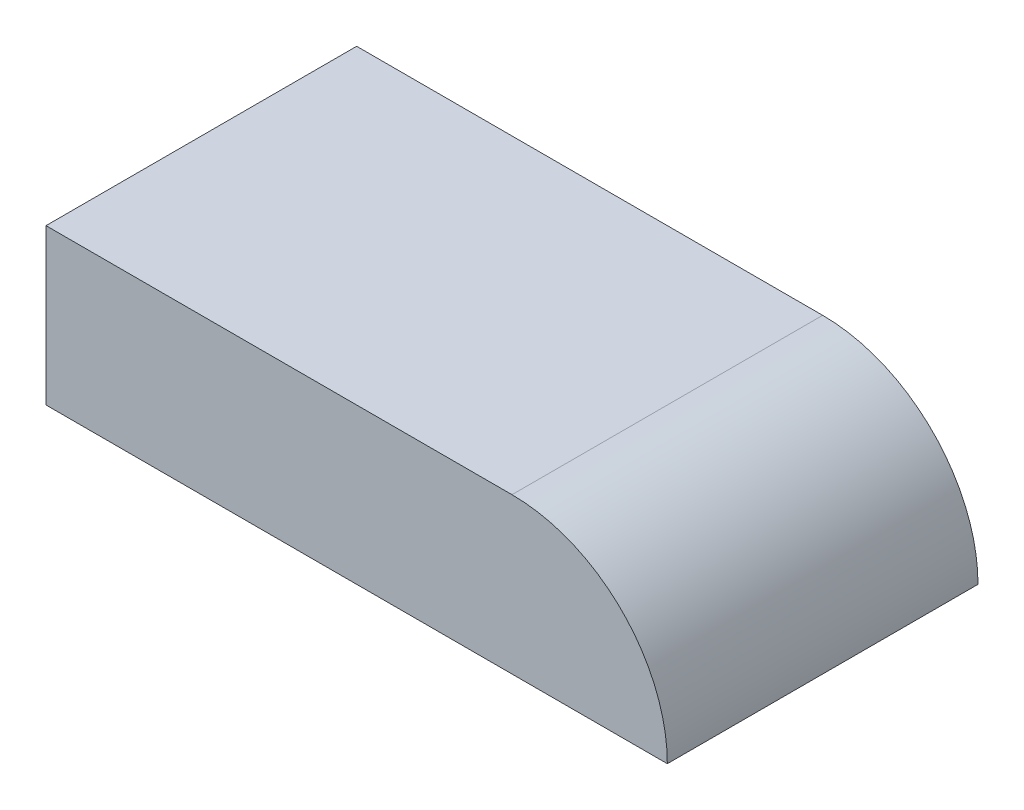
ISO-10303-21;
HEADER;
FILE_DESCRIPTION(('STEP AP214'),'2;1');
FILE_NAME('part.step','',(''),(''),'','','');
FILE_SCHEMA(('AUTOMOTIVE_DESIGN { 1 0 10303 214 1 1 1 1 }'));
ENDSEC;
DATA;
#1=APPLICATION_CONTEXT('core data for automotive mechanical design processes');
#2=APPLICATION_PROTOCOL_DEFINITION('international standard','automotive_design',2000,#1);
#3=PRODUCT_CONTEXT('',#1,'mechanical');
#4=PRODUCT('Part','Part','',(#3));
#5=PRODUCT_RELATED_PRODUCT_CATEGORY('part','',(#4));
#6=PRODUCT_DEFINITION_FORMATION('','',#4);
#7=PRODUCT_DEFINITION_CONTEXT('part definition',#1,'design');
#8=PRODUCT_DEFINITION('design','',#6,#7);
#9=PRODUCT_DEFINITION_SHAPE('','',#8);
#10=(LENGTH_UNIT() NAMED_UNIT(*) SI_UNIT(.MILLI.,.METRE.));
#11=(NAMED_UNIT(*) PLANE_ANGLE_UNIT() SI_UNIT($,.RADIAN.));
#12=(NAMED_UNIT(*) SI_UNIT($,.STERADIAN.) SOLID_ANGLE_UNIT());
#13=UNCERTAINTY_MEASURE_WITH_UNIT(LENGTH_MEASURE(1.E-05),#10,'distance_accuracy_value','');
#14=(GEOMETRIC_REPRESENTATION_CONTEXT(3) GLOBAL_UNCERTAINTY_ASSIGNED_CONTEXT((#13)) GLOBAL_UNIT_ASSIGNED_CONTEXT((#10,
#11,#12)) REPRESENTATION_CONTEXT('',''));
#15=CARTESIAN_POINT('',(0.,0.,0.));
#16=DIRECTION('',(0.,0.,1.));
#17=DIRECTION('',(1.,0.,0.));
#18=AXIS2_PLACEMENT_3D('',#15,#16,#17);
#19=CARTESIAN_POINT('',(0.,0.,10.));
#20=DIRECTION('',(1.,0.,0.));
#21=DIRECTION('',(0.,0.,-1.));
#22=AXIS2_PLACEMENT_3D('',#19,#20,#21);
#23=PLANE('',#22);
#24=DIRECTION('',(0.,-1.,0.));
#25=VECTOR('',#24,1.);
#26=CARTESIAN_POINT('',(0.,0.,0.));
#27=LINE('',#26,#25);
#28=CARTESIAN_POINT('',(0.,5.,0.));
#29=VERTEX_POINT('',#28);
#30=CARTESIAN_POINT('',(0.,0.,0.));
#31=VERTEX_POINT('',#30);
#32=EDGE_CURVE('E91',#29,#31,#27,.T.);
#33=ORIENTED_EDGE('',*,*,#32,.T.);
#34=DIRECTION('',(0.,0.,-1.));
#35=VECTOR('',#34,1.);
#36=CARTESIAN_POINT('',(0.,0.,10.));
#37=LINE('',#36,#35);
#38=CARTESIAN_POINT('',(0.,0.,10.));
#39=VERTEX_POINT('',#38);
#40=EDGE_CURVE('E77',#39,#31,#37,.T.);
#41=ORIENTED_EDGE('',*,*,#40,.F.);
#42=DIRECTION('',(0.,-1.,0.));
#43=VECTOR('',#42,1.);
#44=CARTESIAN_POINT('',(0.,0.,10.));
#45=LINE('',#44,#43);
#46=CARTESIAN_POINT('',(0.,5.,10.));
#47=VERTEX_POINT('',#46);
#48=EDGE_CURVE('E81',#47,#39,#45,.T.);
#49=ORIENTED_EDGE('',*,*,#48,.F.);
#50=DIRECTION('',(0.,0.,-1.));
#51=VECTOR('',#50,1.);
#52=CARTESIAN_POINT('',(0.,5.,10.));
#53=LINE('',#52,#51);
#54=EDGE_CURVE('E95',#47,#29,#53,.T.);
#55=ORIENTED_EDGE('',*,*,#54,.T.);
#56=EDGE_LOOP('',(#33,#41,#49,#55));
#57=FACE_BOUND('',#56,.T.);
#58=ADVANCED_FACE('F33',(#57),#23,.F.);
#59=CARTESIAN_POINT('',(0.,0.,10.));
#60=DIRECTION('',(0.,1.,0.));
#61=DIRECTION('',(0.,0.,1.));
#62=AXIS2_PLACEMENT_3D('',#59,#60,#61);
#63=PLANE('',#62);
#64=DIRECTION('',(1.,0.,0.));
#65=VECTOR('',#64,1.);
#66=CARTESIAN_POINT('',(0.,0.,0.));
#67=LINE('',#66,#65);
#68=CARTESIAN_POINT('',(20.,0.,0.));
#69=VERTEX_POINT('',#68);
#70=EDGE_CURVE('E101',#31,#69,#67,.T.);
#71=ORIENTED_EDGE('',*,*,#70,.T.);
#72=DIRECTION('',(0.,0.,-1.));
#73=VECTOR('',#72,1.);
#74=CARTESIAN_POINT('',(20.,0.,10.));
#75=LINE('',#74,#73);
#76=CARTESIAN_POINT('',(20.,0.,10.));
#77=VERTEX_POINT('',#76);
#78=EDGE_CURVE('E79',#77,#69,#75,.T.);
#79=ORIENTED_EDGE('',*,*,#78,.F.);
#80=DIRECTION('',(1.,0.,0.));
#81=VECTOR('',#80,1.);
#82=CARTESIAN_POINT('',(0.,0.,10.));
#83=LINE('',#82,#81);
#84=EDGE_CURVE('E72',#39,#77,#83,.T.);
#85=ORIENTED_EDGE('',*,*,#84,.F.);
#86=ORIENTED_EDGE('',*,*,#40,.T.);
#87=EDGE_LOOP('',(#71,#79,#85,#86));
#88=FACE_BOUND('',#87,.T.);
#89=ADVANCED_FACE('F75',(#88),#63,.F.);
#90=CARTESIAN_POINT('',(0.,5.,10.));
#91=DIRECTION('',(0.,-1.,0.));
#92=DIRECTION('',(0.,0.,-1.));
#93=AXIS2_PLACEMENT_3D('',#90,#91,#92);
#94=PLANE('',#93);
#95=DIRECTION('',(-1.,0.,0.));
#96=VECTOR('',#95,1.);
#97=CARTESIAN_POINT('',(0.,5.,10.));
#98=LINE('',#97,#96);
#99=CARTESIAN_POINT('',(15.,5.,10.));
#100=VERTEX_POINT('',#99);
#101=EDGE_CURVE('E80',#100,#47,#98,.T.);
#102=ORIENTED_EDGE('',*,*,#101,.F.);
#103=DIRECTION('',(0.,0.,-1.));
#104=VECTOR('',#103,1.);
#105=CARTESIAN_POINT('',(15.,5.,10.));
#106=LINE('',#105,#104);
#107=CARTESIAN_POINT('',(15.,5.,0.));
#108=VERTEX_POINT('',#107);
#109=EDGE_CURVE('E92',#100,#108,#106,.T.);
#110=ORIENTED_EDGE('',*,*,#109,.T.);
#111=DIRECTION('',(-1.,0.,0.));
#112=VECTOR('',#111,1.);
#113=CARTESIAN_POINT('',(0.,5.,0.));
#114=LINE('',#113,#112);
#115=EDGE_CURVE('E88',#108,#29,#114,.T.);
#116=ORIENTED_EDGE('',*,*,#115,.T.);
#117=ORIENTED_EDGE('',*,*,#54,.F.);
#118=EDGE_LOOP('',(#102,#110,#116,#117));
#119=FACE_BOUND('',#118,.T.);
#120=ADVANCED_FACE('F104',(#119),#94,.F.);
#121=CARTESIAN_POINT('',(0.,0.,10.));
#122=DIRECTION('',(0.,0.,-1.));
#123=DIRECTION('',(-1.,0.,0.));
#124=AXIS2_PLACEMENT_3D('',#121,#122,#123);
#125=PLANE('',#124);
#126=ORIENTED_EDGE('',*,*,#84,.T.);
#127=CARTESIAN_POINT('',(15.,0.,10.));
#128=DIRECTION('',(0.,0.,-1.));
#129=DIRECTION('',(-1.,0.,0.));
#130=AXIS2_PLACEMENT_3D('',#127,#128,#129);
#131=CIRCLE('',#130,5.);
#132=EDGE_CURVE('E11',#77,#100,#131,.F.);
#133=ORIENTED_EDGE('',*,*,#132,.T.);
#134=ORIENTED_EDGE('',*,*,#101,.T.);
#135=ORIENTED_EDGE('',*,*,#48,.T.);
#136=EDGE_LOOP('',(#126,#133,#134,#135));
#137=FACE_BOUND('',#136,.T.);
#138=ADVANCED_FACE('F84',(#137),#125,.F.);
#139=CARTESIAN_POINT('',(0.,0.,0.));
#140=DIRECTION('',(0.,0.,-1.));
#141=DIRECTION('',(-1.,0.,0.));
#142=AXIS2_PLACEMENT_3D('',#139,#140,#141);
#143=PLANE('',#142);
#144=ORIENTED_EDGE('',*,*,#115,.F.);
#145=CARTESIAN_POINT('',(15.,0.,0.));
#146=DIRECTION('',(0.,0.,-1.));
#147=DIRECTION('',(-1.,0.,0.));
#148=AXIS2_PLACEMENT_3D('',#145,#146,#147);
#149=CIRCLE('',#148,5.);
#150=EDGE_CURVE('E41',#108,#69,#149,.T.);
#151=ORIENTED_EDGE('',*,*,#150,.T.);
#152=ORIENTED_EDGE('',*,*,#70,.F.);
#153=ORIENTED_EDGE('',*,*,#32,.F.);
#154=EDGE_LOOP('',(#144,#151,#152,#153));
#155=FACE_BOUND('',#154,.T.);
#156=ADVANCED_FACE('F100',(#155),#143,.T.);
#157=CARTESIAN_POINT('',(15.,0.,10.));
#158=DIRECTION('',(0.,0.,-1.));
#159=DIRECTION('',(-1.,0.,0.));
#160=AXIS2_PLACEMENT_3D('',#157,#158,#159);
#161=CYLINDRICAL_SURFACE('',#160,5.);
#162=ORIENTED_EDGE('',*,*,#132,.F.);
#163=ORIENTED_EDGE('',*,*,#78,.T.);
#164=ORIENTED_EDGE('',*,*,#150,.F.);
#165=ORIENTED_EDGE('',*,*,#109,.F.);
#166=EDGE_LOOP('',(#162,#163,#164,#165));
#167=FACE_BOUND('',#166,.T.);
#168=ADVANCED_FACE('F35',(#167),#161,.T.);
#169=CLOSED_SHELL('',(#58,#89,#120,#138,#156,#168));
#170=MANIFOLD_SOLID_BREP('B2',#169);
#171=ADVANCED_BREP_SHAPE_REPRESENTATION('',(#18,#170),#14);
#172=SHAPE_DEFINITION_REPRESENTATION(#9,#171);
ENDSEC;
END-ISO-10303-21;
